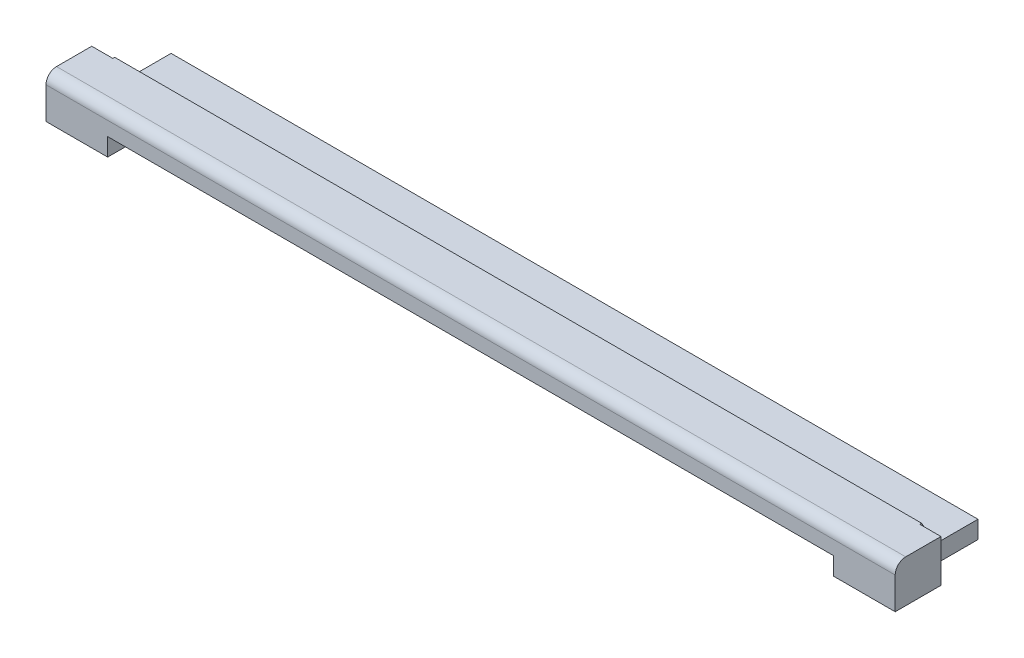
ISO-10303-21;
HEADER;
FILE_DESCRIPTION(('STEP AP214'),'2;1');
FILE_NAME('part.step','',(''),(''),'','','');
FILE_SCHEMA(('AUTOMOTIVE_DESIGN { 1 0 10303 214 1 1 1 1 }'));
ENDSEC;
DATA;
#1=APPLICATION_CONTEXT('core data for automotive mechanical design processes');
#2=APPLICATION_PROTOCOL_DEFINITION('international standard','automotive_design',2000,#1);
#3=PRODUCT_CONTEXT('',#1,'mechanical');
#4=PRODUCT('Part','Part','',(#3));
#5=PRODUCT_RELATED_PRODUCT_CATEGORY('part','',(#4));
#6=PRODUCT_DEFINITION_FORMATION('','',#4);
#7=PRODUCT_DEFINITION_CONTEXT('part definition',#1,'design');
#8=PRODUCT_DEFINITION('design','',#6,#7);
#9=PRODUCT_DEFINITION_SHAPE('','',#8);
#10=(LENGTH_UNIT() NAMED_UNIT(*) SI_UNIT(.MILLI.,.METRE.));
#11=(NAMED_UNIT(*) PLANE_ANGLE_UNIT() SI_UNIT($,.RADIAN.));
#12=(NAMED_UNIT(*) SI_UNIT($,.STERADIAN.) SOLID_ANGLE_UNIT());
#13=UNCERTAINTY_MEASURE_WITH_UNIT(LENGTH_MEASURE(1.E-05),#10,'distance_accuracy_value','');
#14=(GEOMETRIC_REPRESENTATION_CONTEXT(3) GLOBAL_UNCERTAINTY_ASSIGNED_CONTEXT((#13)) GLOBAL_UNIT_ASSIGNED_CONTEXT((#10,
#11,#12)) REPRESENTATION_CONTEXT('',''));
#15=CARTESIAN_POINT('',(0.,0.,0.));
#16=DIRECTION('',(0.,0.,1.));
#17=DIRECTION('',(1.,0.,0.));
#18=AXIS2_PLACEMENT_3D('',#15,#16,#17);
#19=CARTESIAN_POINT('',(-12.05,2.19730035691,0.999871293325));
#20=DIRECTION('',(0.,1.,0.));
#21=DIRECTION('',(0.,0.,1.));
#22=AXIS2_PLACEMENT_3D('',#19,#20,#21);
#23=PLANE('',#22);
#24=DIRECTION('',(1.,0.,0.));
#25=VECTOR('',#24,1.);
#26=CARTESIAN_POINT('',(-12.05,2.19730035691,0.));
#27=LINE('',#26,#25);
#28=CARTESIAN_POINT('',(12.05,2.19730035691,0.));
#29=VERTEX_POINT('',#28);
#30=CARTESIAN_POINT('',(11.45,2.19730035691,0.));
#31=VERTEX_POINT('',#30);
#32=EDGE_CURVE('E175',#29,#31,#27,.F.);
#33=ORIENTED_EDGE('',*,*,#32,.T.);
#34=DIRECTION('',(0.,0.,1.));
#35=VECTOR('',#34,1.);
#36=CARTESIAN_POINT('',(11.45,2.19730035691,0.999871293325));
#37=LINE('',#36,#35);
#38=CARTESIAN_POINT('',(11.45,2.19730035691,-0.0524146670386495));
#39=VERTEX_POINT('',#38);
#40=EDGE_CURVE('E171',#31,#39,#37,.F.);
#41=ORIENTED_EDGE('',*,*,#40,.T.);
#42=DIRECTION('',(1.,0.,0.));
#43=VECTOR('',#42,1.);
#44=CARTESIAN_POINT('',(-12.05,2.19730035691,-0.05241466703865));
#45=LINE('',#44,#43);
#46=CARTESIAN_POINT('',(-11.45,2.19730035691,-0.05241466703865));
#47=VERTEX_POINT('',#46);
#48=EDGE_CURVE('E135',#47,#39,#45,.T.);
#49=ORIENTED_EDGE('',*,*,#48,.F.);
#50=DIRECTION('',(0.,0.,1.));
#51=VECTOR('',#50,1.);
#52=CARTESIAN_POINT('',(-11.45,2.19730035691,0.999871293325));
#53=LINE('',#52,#51);
#54=CARTESIAN_POINT('',(-11.45,2.19730035691,0.));
#55=VERTEX_POINT('',#54);
#56=EDGE_CURVE('E195',#47,#55,#53,.T.);
#57=ORIENTED_EDGE('',*,*,#56,.T.);
#58=DIRECTION('',(1.,0.,0.));
#59=VECTOR('',#58,1.);
#60=CARTESIAN_POINT('',(-12.05,2.19730035691,0.));
#61=LINE('',#60,#59);
#62=CARTESIAN_POINT('',(-12.05,2.19730035691,0.));
#63=VERTEX_POINT('',#62);
#64=EDGE_CURVE('E179',#55,#63,#61,.F.);
#65=ORIENTED_EDGE('',*,*,#64,.T.);
#66=DIRECTION('',(0.,0.,1.));
#67=VECTOR('',#66,1.);
#68=CARTESIAN_POINT('',(-12.05,2.19730035691,0.999871293325));
#69=LINE('',#68,#67);
#70=CARTESIAN_POINT('',(-12.05,2.19730035691015,0.999871293324998));
#71=VERTEX_POINT('',#70);
#72=EDGE_CURVE('E176',#63,#71,#69,.T.);
#73=ORIENTED_EDGE('',*,*,#72,.T.);
#74=DIRECTION('',(-1.,0.,0.));
#75=VECTOR('',#74,1.);
#76=CARTESIAN_POINT('',(-12.05,2.19730035691029,0.999871293324997));
#77=LINE('',#76,#75);
#78=CARTESIAN_POINT('',(12.05,2.19730035691015,0.999871293324998));
#79=VERTEX_POINT('',#78);
#80=EDGE_CURVE('E134',#79,#71,#77,.T.);
#81=ORIENTED_EDGE('',*,*,#80,.F.);
#82=DIRECTION('',(0.,0.,1.));
#83=VECTOR('',#82,1.);
#84=CARTESIAN_POINT('',(12.05,2.19730035691,0.999871293325));
#85=LINE('',#84,#83);
#86=EDGE_CURVE('E130',#79,#29,#85,.F.);
#87=ORIENTED_EDGE('',*,*,#86,.T.);
#88=EDGE_LOOP('',(#33,#41,#49,#57,#65,#73,#81,#87));
#89=FACE_BOUND('',#88,.T.);
#90=ADVANCED_FACE('F17',(#89),#23,.T.);
#91=CARTESIAN_POINT('',(-12.05,2.19730035691,-0.05241466703865));
#92=DIRECTION('',(0.,0.490259924169971,-0.871576277070948));
#93=DIRECTION('',(0.,0.871576277070948,0.490259924169971));
#94=AXIS2_PLACEMENT_3D('',#91,#92,#93);
#95=PLANE('',#94);
#96=DIRECTION('',(0.,0.871576277070948,0.490259924169971));
#97=VECTOR('',#96,1.);
#98=CARTESIAN_POINT('',(-11.45,2.19730035691,-0.05241466703865));
#99=LINE('',#98,#97);
#100=CARTESIAN_POINT('',(-11.45,1.49577911788297,-0.447018874008667));
#101=VERTEX_POINT('',#100);
#102=EDGE_CURVE('E170',#101,#47,#99,.T.);
#103=ORIENTED_EDGE('',*,*,#102,.T.);
#104=ORIENTED_EDGE('',*,*,#48,.T.);
#105=DIRECTION('',(0.,0.871576277070948,0.490259924169971));
#106=VECTOR('',#105,1.);
#107=CARTESIAN_POINT('',(11.45,2.19730035691,-0.0524146670386489));
#108=LINE('',#107,#106);
#109=CARTESIAN_POINT('',(11.45,1.49577843398572,-0.447019258699545));
#110=VERTEX_POINT('',#109);
#111=EDGE_CURVE('E167',#39,#110,#108,.F.);
#112=ORIENTED_EDGE('',*,*,#111,.T.);
#113=DIRECTION('',(1.,0.,0.));
#114=VECTOR('',#113,1.);
#115=CARTESIAN_POINT('',(-12.05,1.49577843398513,-0.447018970182603));
#116=LINE('',#115,#114);
#117=EDGE_CURVE('E153',#101,#110,#116,.T.);
#118=ORIENTED_EDGE('',*,*,#117,.F.);
#119=EDGE_LOOP('',(#103,#104,#112,#118));
#120=FACE_BOUND('',#119,.T.);
#121=ADVANCED_FACE('F212',(#120),#95,.T.);
#122=CARTESIAN_POINT('',(-12.05,1.495778433986,-0.447019354872));
#123=DIRECTION('',(0.,0.999999999997422,2.27065273328796E-06));
#124=DIRECTION('',(0.,-2.27065273328796E-06,0.999999999997422));
#125=AXIS2_PLACEMENT_3D('',#122,#123,#124);
#126=PLANE('',#125);
#127=DIRECTION('',(0.,0.,-1.));
#128=VECTOR('',#127,1.);
#129=CARTESIAN_POINT('',(-11.45,1.49578116957499,-0.1));
#130=LINE('',#129,#128);
#131=CARTESIAN_POINT('',(-11.45,1.49578116957466,-1.65177876867856));
#132=VERTEX_POINT('',#131);
#133=EDGE_CURVE('E155',#132,#101,#130,.F.);
#134=ORIENTED_EDGE('',*,*,#133,.T.);
#135=ORIENTED_EDGE('',*,*,#117,.T.);
#136=DIRECTION('',(0.,-2.27065273328796E-06,0.999999999997422));
#137=VECTOR('',#136,1.);
#138=CARTESIAN_POINT('',(11.45,1.495778433986,-0.447019354872));
#139=LINE('',#138,#137);
#140=CARTESIAN_POINT('',(11.45,1.49578048567739,-1.65177820109122));
#141=VERTEX_POINT('',#140);
#142=EDGE_CURVE('E158',#110,#141,#139,.F.);
#143=ORIENTED_EDGE('',*,*,#142,.T.);
#144=DIRECTION('',(1.,0.,0.));
#145=VECTOR('',#144,1.);
#146=CARTESIAN_POINT('',(-12.05,1.4957811695737,-1.651778201092));
#147=LINE('',#146,#145);
#148=EDGE_CURVE('E232',#132,#141,#147,.T.);
#149=ORIENTED_EDGE('',*,*,#148,.F.);
#150=EDGE_LOOP('',(#134,#135,#143,#149));
#151=FACE_BOUND('',#150,.T.);
#152=ADVANCED_FACE('F315',(#151),#126,.T.);
#153=CARTESIAN_POINT('',(0.,1.5,2.6));
#154=DIRECTION('',(0.,-1.,0.));
#155=DIRECTION('',(0.,0.,-1.));
#156=AXIS2_PLACEMENT_3D('',#153,#154,#155);
#157=PLANE('',#156);
#158=DIRECTION('',(1.,0.,0.));
#159=VECTOR('',#158,1.);
#160=CARTESIAN_POINT('',(-12.05,1.5,1.29822180849531));
#161=LINE('',#160,#159);
#162=CARTESIAN_POINT('',(-10.3,1.5,1.29822173694714));
#163=VERTEX_POINT('',#162);
#164=CARTESIAN_POINT('',(10.3,1.5,1.29822137920712));
#165=VERTEX_POINT('',#164);
#166=EDGE_CURVE('E280',#163,#165,#161,.T.);
#167=ORIENTED_EDGE('',*,*,#166,.F.);
#168=DIRECTION('',(0.,0.,-1.));
#169=VECTOR('',#168,1.);
#170=CARTESIAN_POINT('',(-10.3,1.5,2.6));
#171=LINE('',#170,#169);
#172=CARTESIAN_POINT('',(-10.3,1.5,0.0999999999999999));
#173=VERTEX_POINT('',#172);
#174=EDGE_CURVE('E251',#173,#163,#171,.F.);
#175=ORIENTED_EDGE('',*,*,#174,.F.);
#176=DIRECTION('',(1.,0.,0.));
#177=VECTOR('',#176,1.);
#178=CARTESIAN_POINT('',(0.,1.5,0.1));
#179=LINE('',#178,#177);
#180=CARTESIAN_POINT('',(10.3,1.5,0.0999999999999999));
#181=VERTEX_POINT('',#180);
#182=EDGE_CURVE('E144',#181,#173,#179,.F.);
#183=ORIENTED_EDGE('',*,*,#182,.F.);
#184=DIRECTION('',(0.,0.,1.));
#185=VECTOR('',#184,1.);
#186=CARTESIAN_POINT('',(10.3,1.5,2.6));
#187=LINE('',#186,#185);
#188=EDGE_CURVE('E140',#165,#181,#187,.F.);
#189=ORIENTED_EDGE('',*,*,#188,.F.);
#190=EDGE_LOOP('',(#167,#175,#183,#189));
#191=FACE_BOUND('',#190,.T.);
#192=ADVANCED_FACE('F296',(#191),#157,.T.);
#193=CARTESIAN_POINT('',(-12.05,1.900051660455,1.000974002793));
#194=DIRECTION('',(-1.,0.,0.));
#195=DIRECTION('',(0.,0.,1.));
#196=AXIS2_PLACEMENT_3D('',#193,#194,#195);
#197=CYLINDRICAL_SURFACE('',#196,0.29725074182);
#198=CARTESIAN_POINT('',(-12.05,1.900051660455,1.000974002793));
#199=DIRECTION('',(-1.,0.,0.));
#200=DIRECTION('',(0.,0.,1.));
#201=AXIS2_PLACEMENT_3D('',#198,#199,#200);
#202=CIRCLE('',#201,0.29725074182);
#203=CARTESIAN_POINT('',(-12.05,1.89895303716158,1.29822271437895));
#204=VERTEX_POINT('',#203);
#205=EDGE_CURVE('E151',#71,#204,#202,.F.);
#206=ORIENTED_EDGE('',*,*,#205,.T.);
#207=DIRECTION('',(1.,0.,0.));
#208=VECTOR('',#207,1.);
#209=CARTESIAN_POINT('',(-12.05,1.89895303716215,1.29822271437914));
#210=LINE('',#209,#208);
#211=CARTESIAN_POINT('',(12.05,1.89895303716215,1.29822322193761));
#212=VERTEX_POINT('',#211);
#213=EDGE_CURVE('E138',#212,#204,#210,.F.);
#214=ORIENTED_EDGE('',*,*,#213,.F.);
#215=DIRECTION('',(0.,1.,0.));
#216=VECTOR('',#215,1.);
#217=CARTESIAN_POINT('',(12.05,1.451827815541,1.298224744613));
#218=LINE('',#217,#216);
#219=CARTESIAN_POINT('',(12.05,1.900051660455,1.298224744613));
#220=VERTEX_POINT('',#219);
#221=EDGE_CURVE('E126',#220,#212,#218,.F.);
#222=ORIENTED_EDGE('',*,*,#221,.F.);
#223=CARTESIAN_POINT('',(12.05,1.900051660455,1.000974002793));
#224=DIRECTION('',(-1.,0.,0.));
#225=DIRECTION('',(0.,0.,1.));
#226=AXIS2_PLACEMENT_3D('',#223,#224,#225);
#227=CIRCLE('',#226,0.29725074182);
#228=EDGE_CURVE('E20',#220,#79,#227,.T.);
#229=ORIENTED_EDGE('',*,*,#228,.T.);
#230=ORIENTED_EDGE('',*,*,#80,.T.);
#231=EDGE_LOOP('',(#206,#214,#222,#229,#230));
#232=FACE_BOUND('',#231,.T.);
#233=ADVANCED_FACE('F136',(#232),#197,.T.);
#234=CARTESIAN_POINT('',(-12.05,1.451827815541,-0.07423294469808));
#235=DIRECTION('',(1.,0.,0.));
#236=DIRECTION('',(0.,0.,-1.));
#237=AXIS2_PLACEMENT_3D('',#234,#235,#236);
#238=PLANE('',#237);
#239=DIRECTION('',(0.,-0.999999999997422,-2.27065279629096E-06));
#240=VECTOR('',#239,1.);
#241=CARTESIAN_POINT('',(-12.05,0.995841761998,1.298220663727));
#242=LINE('',#241,#240);
#243=CARTESIAN_POINT('',(-12.05,0.995841762001355,1.298220663727));
#244=VERTEX_POINT('',#243);
#245=EDGE_CURVE('E248',#204,#244,#242,.T.);
#246=ORIENTED_EDGE('',*,*,#245,.F.);
#247=ORIENTED_EDGE('',*,*,#205,.F.);
#248=ORIENTED_EDGE('',*,*,#72,.F.);
#249=DIRECTION('',(0.,1.,0.));
#250=VECTOR('',#249,1.);
#251=CARTESIAN_POINT('',(-12.05,1.11397338403,0.));
#252=LINE('',#251,#250);
#253=CARTESIAN_POINT('',(-12.05,0.99584286742592,8.36800789251468E-13));
#254=VERTEX_POINT('',#253);
#255=EDGE_CURVE('E152',#63,#254,#252,.F.);
#256=ORIENTED_EDGE('',*,*,#255,.T.);
#257=DIRECTION('',(0.,2.27065272919496E-06,-0.999999999997422));
#258=VECTOR('',#257,1.);
#259=CARTESIAN_POINT('',(-12.05,0.995848460423,-1.651779336266));
#260=LINE('',#259,#258);
#261=EDGE_CURVE('E247',#244,#254,#260,.T.);
#262=ORIENTED_EDGE('',*,*,#261,.F.);
#263=EDGE_LOOP('',(#246,#247,#248,#256,#262));
#264=FACE_BOUND('',#263,.T.);
#265=ADVANCED_FACE('F354',(#264),#238,.F.);
#266=CARTESIAN_POINT('',(0.,1.11397338403,0.));
#267=DIRECTION('',(0.,0.,1.));
#268=DIRECTION('',(1.,0.,0.));
#269=AXIS2_PLACEMENT_3D('',#266,#267,#268);
#270=PLANE('',#269);
#271=ORIENTED_EDGE('',*,*,#64,.F.);
#272=DIRECTION('',(0.,1.,0.));
#273=VECTOR('',#272,1.);
#274=CARTESIAN_POINT('',(-11.45,1.1,0.));
#275=LINE('',#274,#273);
#276=CARTESIAN_POINT('',(-11.45,0.995843972853887,8.3676013167E-13));
#277=VERTEX_POINT('',#276);
#278=EDGE_CURVE('E198',#55,#277,#275,.F.);
#279=ORIENTED_EDGE('',*,*,#278,.T.);
#280=DIRECTION('',(1.,0.,0.));
#281=VECTOR('',#280,1.);
#282=CARTESIAN_POINT('',(-12.05,0.995844709805742,3.34693210646275E-12));
#283=LINE('',#282,#281);
#284=EDGE_CURVE('E267',#254,#277,#283,.T.);
#285=ORIENTED_EDGE('',*,*,#284,.F.);
#286=ORIENTED_EDGE('',*,*,#255,.F.);
#287=EDGE_LOOP('',(#271,#279,#285,#286));
#288=FACE_BOUND('',#287,.T.);
#289=ADVANCED_FACE('F351',(#288),#270,.F.);
#290=CARTESIAN_POINT('',(-11.45,1.1,-0.1));
#291=DIRECTION('',(1.,0.,0.));
#292=DIRECTION('',(0.,0.,-1.));
#293=AXIS2_PLACEMENT_3D('',#290,#291,#292);
#294=PLANE('',#293);
#295=ORIENTED_EDGE('',*,*,#56,.F.);
#296=ORIENTED_EDGE('',*,*,#102,.F.);
#297=ORIENTED_EDGE('',*,*,#133,.F.);
#298=DIRECTION('',(0.,0.999999999997422,2.27065273324096E-06));
#299=VECTOR('',#298,1.);
#300=CARTESIAN_POINT('',(-11.45,1.495781169575,-1.651778201092));
#301=LINE('',#300,#299);
#302=CARTESIAN_POINT('',(-11.45,0.995846585114629,-1.65177933626475));
#303=VERTEX_POINT('',#302);
#304=EDGE_CURVE('E200',#303,#132,#301,.T.);
#305=ORIENTED_EDGE('',*,*,#304,.F.);
#306=DIRECTION('',(0.,2.27065272919496E-06,-0.999999999997422));
#307=VECTOR('',#306,1.);
#308=CARTESIAN_POINT('',(-11.45,0.995848460423,-1.651779336266));
#309=LINE('',#308,#307);
#310=EDGE_CURVE('E271',#277,#303,#309,.T.);
#311=ORIENTED_EDGE('',*,*,#310,.F.);
#312=ORIENTED_EDGE('',*,*,#278,.F.);
#313=EDGE_LOOP('',(#295,#296,#297,#305,#311,#312));
#314=FACE_BOUND('',#313,.T.);
#315=ADVANCED_FACE('F215',(#314),#294,.F.);
#316=CARTESIAN_POINT('',(-12.05,1.495781169575,-1.651778201092));
#317=DIRECTION('',(0.,2.27065273324096E-06,-0.999999999997422));
#318=DIRECTION('',(0.,0.999999999997422,2.27065273324096E-06));
#319=AXIS2_PLACEMENT_3D('',#316,#317,#318);
#320=PLANE('',#319);
#321=ORIENTED_EDGE('',*,*,#304,.T.);
#322=ORIENTED_EDGE('',*,*,#148,.T.);
#323=DIRECTION('',(0.,1.,0.));
#324=VECTOR('',#323,1.);
#325=CARTESIAN_POINT('',(11.45,1.1,-1.651778201092));
#326=LINE('',#325,#324);
#327=CARTESIAN_POINT('',(11.45,0.995848460423322,-1.65177905247119));
#328=VERTEX_POINT('',#327);
#329=EDGE_CURVE('E230',#141,#328,#326,.F.);
#330=ORIENTED_EDGE('',*,*,#329,.T.);
#331=DIRECTION('',(1.,0.,0.));
#332=VECTOR('',#331,1.);
#333=CARTESIAN_POINT('',(-12.05,0.995848460423,-1.65177933626164));
#334=LINE('',#333,#332);
#335=EDGE_CURVE('E275',#303,#328,#334,.T.);
#336=ORIENTED_EDGE('',*,*,#335,.F.);
#337=EDGE_LOOP('',(#321,#322,#330,#336));
#338=FACE_BOUND('',#337,.T.);
#339=ADVANCED_FACE('F313',(#338),#320,.T.);
#340=CARTESIAN_POINT('',(11.45,1.1,-0.1));
#341=DIRECTION('',(-1.,0.,0.));
#342=DIRECTION('',(0.,0.,1.));
#343=AXIS2_PLACEMENT_3D('',#340,#341,#342);
#344=PLANE('',#343);
#345=ORIENTED_EDGE('',*,*,#142,.F.);
#346=ORIENTED_EDGE('',*,*,#111,.F.);
#347=ORIENTED_EDGE('',*,*,#40,.F.);
#348=DIRECTION('',(0.,1.,0.));
#349=VECTOR('',#348,1.);
#350=CARTESIAN_POINT('',(11.45,1.11397338403,0.));
#351=LINE('',#350,#349);
#352=CARTESIAN_POINT('',(11.45,0.995847053941544,-1.06440193031049E-12));
#353=VERTEX_POINT('',#352);
#354=EDGE_CURVE('E146',#31,#353,#351,.F.);
#355=ORIENTED_EDGE('',*,*,#354,.T.);
#356=DIRECTION('',(0.,2.27065272919496E-06,-0.999999999997422));
#357=VECTOR('',#356,1.);
#358=CARTESIAN_POINT('',(11.45,0.995848460423,-1.651779336266));
#359=LINE('',#358,#357);
#360=EDGE_CURVE('E309',#328,#353,#359,.F.);
#361=ORIENTED_EDGE('',*,*,#360,.F.);
#362=ORIENTED_EDGE('',*,*,#329,.F.);
#363=EDGE_LOOP('',(#345,#346,#347,#355,#361,#362));
#364=FACE_BOUND('',#363,.T.);
#365=ADVANCED_FACE('F222',(#364),#344,.F.);
#366=CARTESIAN_POINT('',(0.,1.11397338403,0.));
#367=DIRECTION('',(0.,0.,1.));
#368=DIRECTION('',(1.,0.,0.));
#369=AXIS2_PLACEMENT_3D('',#366,#367,#368);
#370=PLANE('',#369);
#371=ORIENTED_EDGE('',*,*,#32,.F.);
#372=DIRECTION('',(0.,1.,0.));
#373=VECTOR('',#372,1.);
#374=CARTESIAN_POINT('',(12.05,1.451827815541,0.));
#375=LINE('',#374,#373);
#376=CARTESIAN_POINT('',(12.05,0.995844910508701,-1.06442225910122E-12));
#377=VERTEX_POINT('',#376);
#378=EDGE_CURVE('E141',#377,#29,#375,.T.);
#379=ORIENTED_EDGE('',*,*,#378,.F.);
#380=DIRECTION('',(1.,0.,0.));
#381=VECTOR('',#380,1.);
#382=CARTESIAN_POINT('',(-12.05,0.995844709805742,-4.25787877178507E-12));
#383=LINE('',#382,#381);
#384=EDGE_CURVE('E228',#353,#377,#383,.T.);
#385=ORIENTED_EDGE('',*,*,#384,.F.);
#386=ORIENTED_EDGE('',*,*,#354,.F.);
#387=EDGE_LOOP('',(#371,#379,#385,#386));
#388=FACE_BOUND('',#387,.T.);
#389=ADVANCED_FACE('F226',(#388),#370,.F.);
#390=CARTESIAN_POINT('',(12.05,1.451827815541,-0.07423294469808));
#391=DIRECTION('',(1.,0.,0.));
#392=DIRECTION('',(0.,0.,-1.));
#393=AXIS2_PLACEMENT_3D('',#390,#391,#392);
#394=PLANE('',#393);
#395=ORIENTED_EDGE('',*,*,#228,.F.);
#396=ORIENTED_EDGE('',*,*,#221,.T.);
#397=DIRECTION('',(0.,-0.999999999997422,-2.27065279629096E-06));
#398=VECTOR('',#397,1.);
#399=CARTESIAN_POINT('',(12.05,0.995841761998,1.298220663727));
#400=LINE('',#399,#398);
#401=CARTESIAN_POINT('',(12.05,0.995841932048265,1.29822066372739));
#402=VERTEX_POINT('',#401);
#403=EDGE_CURVE('E241',#402,#212,#400,.F.);
#404=ORIENTED_EDGE('',*,*,#403,.F.);
#405=DIRECTION('',(0.,2.27065272919496E-06,-0.999999999997422));
#406=VECTOR('',#405,1.);
#407=CARTESIAN_POINT('',(12.05,0.995848460423,-1.651779336266));
#408=LINE('',#407,#406);
#409=EDGE_CURVE('E258',#377,#402,#408,.F.);
#410=ORIENTED_EDGE('',*,*,#409,.F.);
#411=ORIENTED_EDGE('',*,*,#378,.T.);
#412=ORIENTED_EDGE('',*,*,#86,.F.);
#413=EDGE_LOOP('',(#395,#396,#404,#410,#411,#412));
#414=FACE_BOUND('',#413,.T.);
#415=ADVANCED_FACE('F125',(#414),#394,.T.);
#416=CARTESIAN_POINT('',(10.3,0.75,2.6));
#417=DIRECTION('',(-1.,0.,0.));
#418=DIRECTION('',(0.,0.,1.));
#419=AXIS2_PLACEMENT_3D('',#416,#417,#418);
#420=PLANE('',#419);
#421=DIRECTION('',(0.,-0.999999999997422,-2.27065279629096E-06));
#422=VECTOR('',#421,1.);
#423=CARTESIAN_POINT('',(10.3,0.995841761998,1.298220663727));
#424=LINE('',#423,#422);
#425=CARTESIAN_POINT('',(10.3,0.995842782276385,1.29822066372777));
#426=VERTEX_POINT('',#425);
#427=EDGE_CURVE('E243',#165,#426,#424,.T.);
#428=ORIENTED_EDGE('',*,*,#427,.F.);
#429=ORIENTED_EDGE('',*,*,#188,.T.);
#430=DIRECTION('',(0.,1.,0.));
#431=VECTOR('',#430,1.);
#432=CARTESIAN_POINT('',(10.3,0.75,0.1));
#433=LINE('',#432,#431);
#434=CARTESIAN_POINT('',(10.3,0.99584431269433,0.0999999999999999));
#435=VERTEX_POINT('',#434);
#436=EDGE_CURVE('E288',#435,#181,#433,.T.);
#437=ORIENTED_EDGE('',*,*,#436,.F.);
#438=DIRECTION('',(0.,2.27065272919496E-06,-0.999999999997422));
#439=VECTOR('',#438,1.);
#440=CARTESIAN_POINT('',(10.3,0.995848460423,-1.651779336266));
#441=LINE('',#440,#439);
#442=EDGE_CURVE('E257',#426,#435,#441,.T.);
#443=ORIENTED_EDGE('',*,*,#442,.F.);
#444=EDGE_LOOP('',(#428,#429,#437,#443));
#445=FACE_BOUND('',#444,.T.);
#446=ADVANCED_FACE('F337',(#445),#420,.T.);
#447=CARTESIAN_POINT('',(0.,0.75,0.1));
#448=DIRECTION('',(0.,0.,1.));
#449=DIRECTION('',(1.,0.,0.));
#450=AXIS2_PLACEMENT_3D('',#447,#448,#449);
#451=PLANE('',#450);
#452=DIRECTION('',(1.,0.,0.));
#453=VECTOR('',#452,1.);
#454=CARTESIAN_POINT('',(-12.05,0.995844482740469,0.0999999999999998));
#455=LINE('',#454,#453);
#456=CARTESIAN_POINT('',(-10.3,0.995843462462142,0.0999999999999999));
#457=VERTEX_POINT('',#456);
#458=EDGE_CURVE('E300',#435,#457,#455,.F.);
#459=ORIENTED_EDGE('',*,*,#458,.F.);
#460=ORIENTED_EDGE('',*,*,#436,.T.);
#461=ORIENTED_EDGE('',*,*,#182,.T.);
#462=DIRECTION('',(0.,1.,0.));
#463=VECTOR('',#462,1.);
#464=CARTESIAN_POINT('',(-10.3,0.75,0.0999999999999998));
#465=LINE('',#464,#463);
#466=EDGE_CURVE('E285',#457,#173,#465,.T.);
#467=ORIENTED_EDGE('',*,*,#466,.F.);
#468=EDGE_LOOP('',(#459,#460,#461,#467));
#469=FACE_BOUND('',#468,.T.);
#470=ADVANCED_FACE('F293',(#469),#451,.T.);
#471=CARTESIAN_POINT('',(-10.3,0.75,2.6));
#472=DIRECTION('',(1.,0.,0.));
#473=DIRECTION('',(0.,0.,-1.));
#474=AXIS2_PLACEMENT_3D('',#471,#472,#473);
#475=PLANE('',#474);
#476=DIRECTION('',(0.,-0.999999999997422,-2.27065279629096E-06));
#477=VECTOR('',#476,1.);
#478=CARTESIAN_POINT('',(-10.3,0.995841761998,1.298220663727));
#479=LINE('',#478,#477);
#480=CARTESIAN_POINT('',(-10.3,0.995841761998633,1.29822137920704));
#481=VERTEX_POINT('',#480);
#482=EDGE_CURVE('E35',#481,#163,#479,.F.);
#483=ORIENTED_EDGE('',*,*,#482,.F.);
#484=DIRECTION('',(0.,2.27065272919496E-06,-0.999999999997422));
#485=VECTOR('',#484,1.);
#486=CARTESIAN_POINT('',(-10.3,0.995848460423,-1.651779336266));
#487=LINE('',#486,#485);
#488=EDGE_CURVE('E26',#457,#481,#487,.F.);
#489=ORIENTED_EDGE('',*,*,#488,.F.);
#490=ORIENTED_EDGE('',*,*,#466,.T.);
#491=ORIENTED_EDGE('',*,*,#174,.T.);
#492=EDGE_LOOP('',(#483,#489,#490,#491));
#493=FACE_BOUND('',#492,.T.);
#494=ADVANCED_FACE('F297',(#493),#475,.T.);
#495=CARTESIAN_POINT('',(-12.05,0.995841761998,1.298220663727));
#496=DIRECTION('',(0.,-2.27065279629096E-06,0.999999999997422));
#497=DIRECTION('',(0.,-0.999999999997422,-2.27065279629096E-06));
#498=AXIS2_PLACEMENT_3D('',#495,#496,#497);
#499=PLANE('',#498);
#500=ORIENTED_EDGE('',*,*,#403,.T.);
#501=ORIENTED_EDGE('',*,*,#213,.T.);
#502=ORIENTED_EDGE('',*,*,#245,.T.);
#503=DIRECTION('',(1.,0.,0.));
#504=VECTOR('',#503,1.);
#505=CARTESIAN_POINT('',(-12.05,0.995841761996149,1.298221236111));
#506=LINE('',#505,#504);
#507=EDGE_CURVE('E11',#481,#244,#506,.F.);
#508=ORIENTED_EDGE('',*,*,#507,.F.);
#509=ORIENTED_EDGE('',*,*,#482,.T.);
#510=ORIENTED_EDGE('',*,*,#166,.T.);
#511=ORIENTED_EDGE('',*,*,#427,.T.);
#512=DIRECTION('',(1.,0.,0.));
#513=VECTOR('',#512,1.);
#514=CARTESIAN_POINT('',(-12.05,0.995841761997449,1.298220663727));
#515=LINE('',#514,#513);
#516=EDGE_CURVE('E254',#402,#426,#515,.F.);
#517=ORIENTED_EDGE('',*,*,#516,.F.);
#518=EDGE_LOOP('',(#500,#501,#502,#508,#509,#510,#511,#517));
#519=FACE_BOUND('',#518,.T.);
#520=ADVANCED_FACE('F325',(#519),#499,.T.);
#521=CARTESIAN_POINT('',(-12.05,0.995848460423,-1.651779336266));
#522=DIRECTION('',(0.,-0.999999999997422,-2.27065272919496E-06));
#523=DIRECTION('',(0.,2.27065272919496E-06,-0.999999999997422));
#524=AXIS2_PLACEMENT_3D('',#521,#522,#523);
#525=PLANE('',#524);
#526=ORIENTED_EDGE('',*,*,#488,.T.);
#527=ORIENTED_EDGE('',*,*,#507,.T.);
#528=ORIENTED_EDGE('',*,*,#261,.T.);
#529=ORIENTED_EDGE('',*,*,#284,.T.);
#530=ORIENTED_EDGE('',*,*,#310,.T.);
#531=ORIENTED_EDGE('',*,*,#335,.T.);
#532=ORIENTED_EDGE('',*,*,#360,.T.);
#533=ORIENTED_EDGE('',*,*,#384,.T.);
#534=ORIENTED_EDGE('',*,*,#409,.T.);
#535=ORIENTED_EDGE('',*,*,#516,.T.);
#536=ORIENTED_EDGE('',*,*,#442,.T.);
#537=ORIENTED_EDGE('',*,*,#458,.T.);
#538=EDGE_LOOP('',(#526,#527,#528,#529,#530,#531,#532,#533,#534,#535,#536,#537));
#539=FACE_BOUND('',#538,.T.);
#540=ADVANCED_FACE('F303',(#539),#525,.T.);
#541=CLOSED_SHELL('',(#90,#121,#152,#192,#233,#265,#289,#315,#339,#365,#389,#415,#446,#470,#494,
#520,#540));
#542=MANIFOLD_SOLID_BREP('B1',#541);
#543=ADVANCED_BREP_SHAPE_REPRESENTATION('',(#18,#542),#14);
#544=SHAPE_DEFINITION_REPRESENTATION(#9,#543);
ENDSEC;
END-ISO-10303-21;
